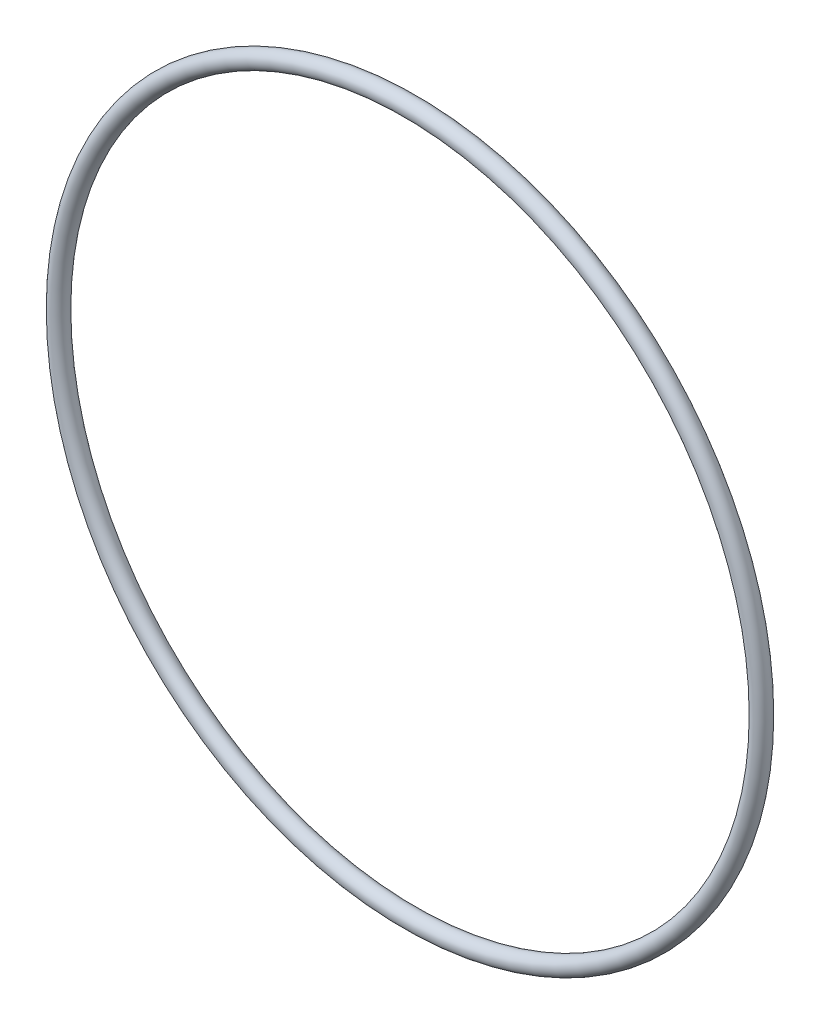
ISO-10303-21;
HEADER;
FILE_DESCRIPTION(('STEP AP214'),'2;1');
FILE_NAME('part.step','',(''),(''),'','','');
FILE_SCHEMA(('AUTOMOTIVE_DESIGN { 1 0 10303 214 1 1 1 1 }'));
ENDSEC;
DATA;
#1=APPLICATION_CONTEXT('core data for automotive mechanical design processes');
#2=APPLICATION_PROTOCOL_DEFINITION('international standard','automotive_design',2000,#1);
#3=PRODUCT_CONTEXT('',#1,'mechanical');
#4=PRODUCT('Part','Part','',(#3));
#5=PRODUCT_RELATED_PRODUCT_CATEGORY('part','',(#4));
#6=PRODUCT_DEFINITION_FORMATION('','',#4);
#7=PRODUCT_DEFINITION_CONTEXT('part definition',#1,'design');
#8=PRODUCT_DEFINITION('design','',#6,#7);
#9=PRODUCT_DEFINITION_SHAPE('','',#8);
#10=(LENGTH_UNIT() NAMED_UNIT(*) SI_UNIT(.MILLI.,.METRE.));
#11=(NAMED_UNIT(*) PLANE_ANGLE_UNIT() SI_UNIT($,.RADIAN.));
#12=(NAMED_UNIT(*) SI_UNIT($,.STERADIAN.) SOLID_ANGLE_UNIT());
#13=UNCERTAINTY_MEASURE_WITH_UNIT(LENGTH_MEASURE(1.E-05),#10,'distance_accuracy_value','');
#14=(GEOMETRIC_REPRESENTATION_CONTEXT(3) GLOBAL_UNCERTAINTY_ASSIGNED_CONTEXT((#13)) GLOBAL_UNIT_ASSIGNED_CONTEXT((#10,
#11,#12)) REPRESENTATION_CONTEXT('',''));
#15=CARTESIAN_POINT('',(0.,0.,0.));
#16=DIRECTION('',(0.,0.,1.));
#17=DIRECTION('',(1.,0.,0.));
#18=AXIS2_PLACEMENT_3D('',#15,#16,#17);
#19=CARTESIAN_POINT('',(0.,0.,0.));
#20=DIRECTION('',(0.,0.,1.));
#21=DIRECTION('',(1.,0.,0.));
#22=AXIS2_PLACEMENT_3D('',#19,#20,#21);
#23=TOROIDAL_SURFACE('',#22,71.4121,1.76529999999999);
#24=CARTESIAN_POINT('',(73.1774,0.,0.));
#25=VERTEX_POINT('',#24);
#26=VERTEX_LOOP('',#25);
#27=FACE_BOUND('',#26,.T.);
#28=ADVANCED_FACE('F30',(#27),#23,.T.);
#29=CLOSED_SHELL('',(#28));
#30=MANIFOLD_SOLID_BREP('B2',#29);
#31=ADVANCED_BREP_SHAPE_REPRESENTATION('',(#18,#30),#14);
#32=SHAPE_DEFINITION_REPRESENTATION(#9,#31);
ENDSEC;
END-ISO-10303-21;
